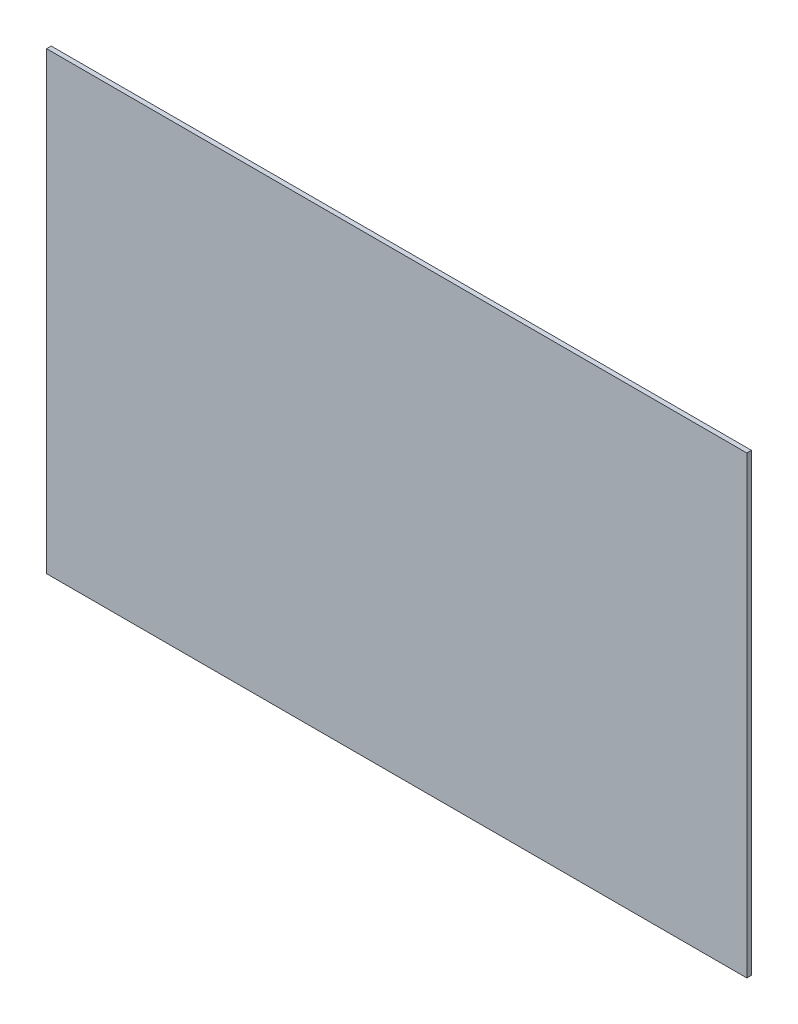
ISO-10303-21;
HEADER;
FILE_DESCRIPTION(('STEP AP214'),'2;1');
FILE_NAME('part.step','',(''),(''),'','','');
FILE_SCHEMA(('AUTOMOTIVE_DESIGN { 1 0 10303 214 1 1 1 1 }'));
ENDSEC;
DATA;
#1=APPLICATION_CONTEXT('core data for automotive mechanical design processes');
#2=APPLICATION_PROTOCOL_DEFINITION('international standard','automotive_design',2000,#1);
#3=PRODUCT_CONTEXT('',#1,'mechanical');
#4=PRODUCT('Part','Part','',(#3));
#5=PRODUCT_RELATED_PRODUCT_CATEGORY('part','',(#4));
#6=PRODUCT_DEFINITION_FORMATION('','',#4);
#7=PRODUCT_DEFINITION_CONTEXT('part definition',#1,'design');
#8=PRODUCT_DEFINITION('design','',#6,#7);
#9=PRODUCT_DEFINITION_SHAPE('','',#8);
#10=(LENGTH_UNIT() NAMED_UNIT(*) SI_UNIT(.MILLI.,.METRE.));
#11=(NAMED_UNIT(*) PLANE_ANGLE_UNIT() SI_UNIT($,.RADIAN.));
#12=(NAMED_UNIT(*) SI_UNIT($,.STERADIAN.) SOLID_ANGLE_UNIT());
#13=UNCERTAINTY_MEASURE_WITH_UNIT(LENGTH_MEASURE(1.E-05),#10,'distance_accuracy_value','');
#14=(GEOMETRIC_REPRESENTATION_CONTEXT(3) GLOBAL_UNCERTAINTY_ASSIGNED_CONTEXT((#13)) GLOBAL_UNIT_ASSIGNED_CONTEXT((#10,
#11,#12)) REPRESENTATION_CONTEXT('',''));
#15=CARTESIAN_POINT('',(0.,0.,0.));
#16=DIRECTION('',(0.,0.,1.));
#17=DIRECTION('',(1.,0.,0.));
#18=AXIS2_PLACEMENT_3D('',#15,#16,#17);
#19=CARTESIAN_POINT('',(0.,0.,10.));
#20=DIRECTION('',(0.,0.,-1.));
#21=DIRECTION('',(-1.,0.,0.));
#22=AXIS2_PLACEMENT_3D('',#19,#20,#21);
#23=PLANE('',#22);
#24=DIRECTION('',(0.,1.,0.));
#25=VECTOR('',#24,1.);
#26=CARTESIAN_POINT('',(1517.1,0.,10.));
#27=LINE('',#26,#25);
#28=CARTESIAN_POINT('',(1517.1,-1500.,10.));
#29=VERTEX_POINT('',#28);
#30=CARTESIAN_POINT('',(1517.1,-515.,10.));
#31=VERTEX_POINT('',#30);
#32=EDGE_CURVE('E54',#29,#31,#27,.T.);
#33=ORIENTED_EDGE('',*,*,#32,.T.);
#34=DIRECTION('',(1.,0.,0.));
#35=VECTOR('',#34,1.);
#36=CARTESIAN_POINT('',(0.,-515.,10.));
#37=LINE('',#36,#35);
#38=CARTESIAN_POINT('',(0.,-515.,10.));
#39=VERTEX_POINT('',#38);
#40=EDGE_CURVE('E94',#39,#31,#37,.T.);
#41=ORIENTED_EDGE('',*,*,#40,.F.);
#42=DIRECTION('',(0.,-1.,0.));
#43=VECTOR('',#42,1.);
#44=CARTESIAN_POINT('',(0.,0.,10.));
#45=LINE('',#44,#43);
#46=CARTESIAN_POINT('',(1.3676858289136E-13,-1500.,10.));
#47=VERTEX_POINT('',#46);
#48=EDGE_CURVE('E11',#39,#47,#45,.T.);
#49=ORIENTED_EDGE('',*,*,#48,.T.);
#50=DIRECTION('',(1.,0.,0.));
#51=VECTOR('',#50,1.);
#52=CARTESIAN_POINT('',(1.3676858289136E-13,-1500.,10.));
#53=LINE('',#52,#51);
#54=EDGE_CURVE('E98',#47,#29,#53,.T.);
#55=ORIENTED_EDGE('',*,*,#54,.T.);
#56=EDGE_LOOP('',(#33,#41,#49,#55));
#57=FACE_BOUND('',#56,.T.);
#58=ADVANCED_FACE('F39',(#57),#23,.F.);
#59=CARTESIAN_POINT('',(0.,0.,0.));
#60=DIRECTION('',(0.,0.,-1.));
#61=DIRECTION('',(-1.,0.,0.));
#62=AXIS2_PLACEMENT_3D('',#59,#60,#61);
#63=PLANE('',#62);
#64=DIRECTION('',(1.,0.,0.));
#65=VECTOR('',#64,1.);
#66=CARTESIAN_POINT('',(0.,-515.,0.));
#67=LINE('',#66,#65);
#68=CARTESIAN_POINT('',(0.,-515.,0.));
#69=VERTEX_POINT('',#68);
#70=CARTESIAN_POINT('',(1517.1,-515.,0.));
#71=VERTEX_POINT('',#70);
#72=EDGE_CURVE('E87',#69,#71,#67,.T.);
#73=ORIENTED_EDGE('',*,*,#72,.T.);
#74=DIRECTION('',(0.,1.,0.));
#75=VECTOR('',#74,1.);
#76=CARTESIAN_POINT('',(1517.1,0.,0.));
#77=LINE('',#76,#75);
#78=CARTESIAN_POINT('',(1517.1,-1500.,0.));
#79=VERTEX_POINT('',#78);
#80=EDGE_CURVE('E80',#79,#71,#77,.T.);
#81=ORIENTED_EDGE('',*,*,#80,.F.);
#82=DIRECTION('',(1.,0.,0.));
#83=VECTOR('',#82,1.);
#84=CARTESIAN_POINT('',(1.3676858289136E-13,-1500.,0.));
#85=LINE('',#84,#83);
#86=CARTESIAN_POINT('',(1.3676858289136E-13,-1500.,0.));
#87=VERTEX_POINT('',#86);
#88=EDGE_CURVE('E93',#87,#79,#85,.T.);
#89=ORIENTED_EDGE('',*,*,#88,.F.);
#90=DIRECTION('',(0.,-1.,0.));
#91=VECTOR('',#90,1.);
#92=CARTESIAN_POINT('',(0.,0.,0.));
#93=LINE('',#92,#91);
#94=EDGE_CURVE('E43',#69,#87,#93,.T.);
#95=ORIENTED_EDGE('',*,*,#94,.F.);
#96=EDGE_LOOP('',(#73,#81,#89,#95));
#97=FACE_BOUND('',#96,.T.);
#98=ADVANCED_FACE('F92',(#97),#63,.T.);
#99=CARTESIAN_POINT('',(1.3676858289136E-13,-1500.,0.));
#100=DIRECTION('',(0.,-1.,0.));
#101=DIRECTION('',(0.,0.,-1.));
#102=AXIS2_PLACEMENT_3D('',#99,#100,#101);
#103=PLANE('',#102);
#104=ORIENTED_EDGE('',*,*,#88,.T.);
#105=DIRECTION('',(0.,0.,1.));
#106=VECTOR('',#105,1.);
#107=CARTESIAN_POINT('',(1517.1,-1500.,0.));
#108=LINE('',#107,#106);
#109=EDGE_CURVE('E77',#79,#29,#108,.T.);
#110=ORIENTED_EDGE('',*,*,#109,.T.);
#111=ORIENTED_EDGE('',*,*,#54,.F.);
#112=DIRECTION('',(0.,0.,1.));
#113=VECTOR('',#112,1.);
#114=CARTESIAN_POINT('',(1.3676858289136E-13,-1500.,0.));
#115=LINE('',#114,#113);
#116=EDGE_CURVE('E97',#87,#47,#115,.T.);
#117=ORIENTED_EDGE('',*,*,#116,.F.);
#118=EDGE_LOOP('',(#104,#110,#111,#117));
#119=FACE_BOUND('',#118,.T.);
#120=ADVANCED_FACE('F96',(#119),#103,.T.);
#121=CARTESIAN_POINT('',(0.,0.,10.));
#122=DIRECTION('',(1.,0.,0.));
#123=DIRECTION('',(0.,0.,-1.));
#124=AXIS2_PLACEMENT_3D('',#121,#122,#123);
#125=PLANE('',#124);
#126=ORIENTED_EDGE('',*,*,#48,.F.);
#127=DIRECTION('',(0.,0.,1.));
#128=VECTOR('',#127,1.);
#129=CARTESIAN_POINT('',(0.,-515.,0.));
#130=LINE('',#129,#128);
#131=EDGE_CURVE('E86',#69,#39,#130,.T.);
#132=ORIENTED_EDGE('',*,*,#131,.F.);
#133=ORIENTED_EDGE('',*,*,#94,.T.);
#134=ORIENTED_EDGE('',*,*,#116,.T.);
#135=EDGE_LOOP('',(#126,#132,#133,#134));
#136=FACE_BOUND('',#135,.T.);
#137=ADVANCED_FACE('F41',(#136),#125,.F.);
#138=CARTESIAN_POINT('',(1517.1,0.,0.));
#139=DIRECTION('',(1.,0.,0.));
#140=DIRECTION('',(0.,0.,-1.));
#141=AXIS2_PLACEMENT_3D('',#138,#139,#140);
#142=PLANE('',#141);
#143=ORIENTED_EDGE('',*,*,#32,.F.);
#144=ORIENTED_EDGE('',*,*,#109,.F.);
#145=ORIENTED_EDGE('',*,*,#80,.T.);
#146=DIRECTION('',(0.,0.,1.));
#147=VECTOR('',#146,1.);
#148=CARTESIAN_POINT('',(1517.1,-515.,0.));
#149=LINE('',#148,#147);
#150=EDGE_CURVE('E101',#71,#31,#149,.T.);
#151=ORIENTED_EDGE('',*,*,#150,.T.);
#152=EDGE_LOOP('',(#143,#144,#145,#151));
#153=FACE_BOUND('',#152,.T.);
#154=ADVANCED_FACE('F79',(#153),#142,.T.);
#155=CARTESIAN_POINT('',(0.,-515.,0.));
#156=DIRECTION('',(0.,-1.,0.));
#157=DIRECTION('',(0.,0.,-1.));
#158=AXIS2_PLACEMENT_3D('',#155,#156,#157);
#159=PLANE('',#158);
#160=ORIENTED_EDGE('',*,*,#40,.T.);
#161=ORIENTED_EDGE('',*,*,#150,.F.);
#162=ORIENTED_EDGE('',*,*,#72,.F.);
#163=ORIENTED_EDGE('',*,*,#131,.T.);
#164=EDGE_LOOP('',(#160,#161,#162,#163));
#165=FACE_BOUND('',#164,.T.);
#166=ADVANCED_FACE('F118',(#165),#159,.F.);
#167=CLOSED_SHELL('',(#58,#98,#120,#137,#154,#166));
#168=MANIFOLD_SOLID_BREP('B2',#167);
#169=ADVANCED_BREP_SHAPE_REPRESENTATION('',(#18,#168),#14);
#170=SHAPE_DEFINITION_REPRESENTATION(#9,#169);
ENDSEC;
END-ISO-10303-21;
